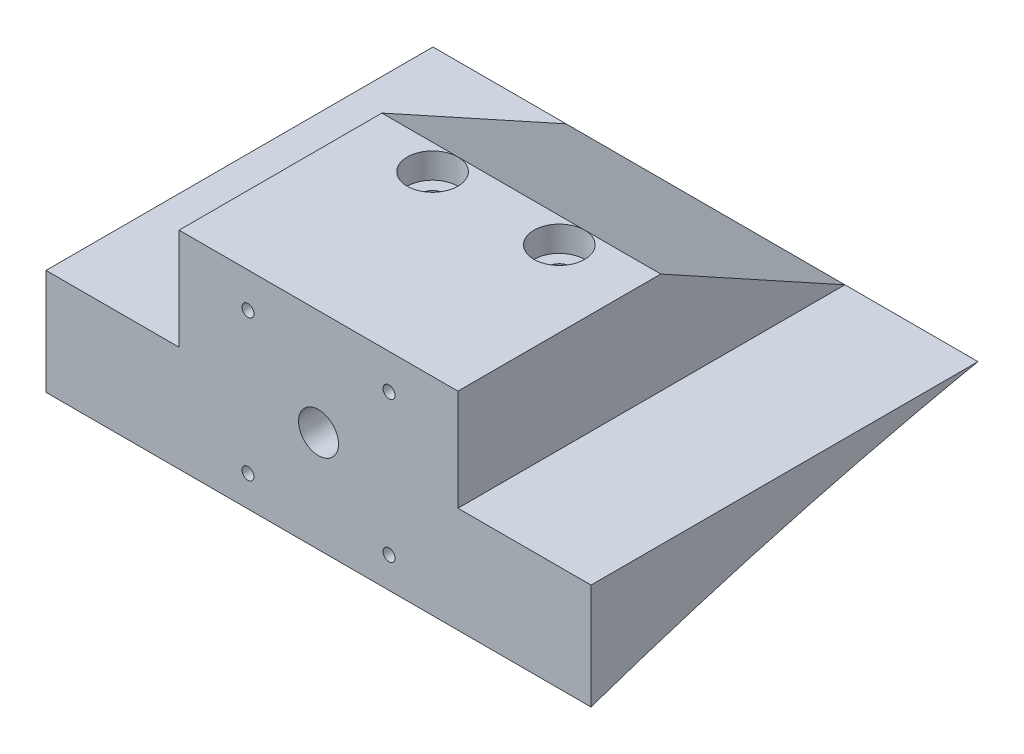
ISO-10303-21;
HEADER;
FILE_DESCRIPTION(('STEP AP214'),'2;1');
FILE_NAME('part.step','',(''),(''),'','','');
FILE_SCHEMA(('AUTOMOTIVE_DESIGN { 1 0 10303 214 1 1 1 1 }'));
ENDSEC;
DATA;
#1=APPLICATION_CONTEXT('core data for automotive mechanical design processes');
#2=APPLICATION_PROTOCOL_DEFINITION('international standard','automotive_design',2000,#1);
#3=PRODUCT_CONTEXT('',#1,'mechanical');
#4=PRODUCT('Part','Part','',(#3));
#5=PRODUCT_RELATED_PRODUCT_CATEGORY('part','',(#4));
#6=PRODUCT_DEFINITION_FORMATION('','',#4);
#7=PRODUCT_DEFINITION_CONTEXT('part definition',#1,'design');
#8=PRODUCT_DEFINITION('design','',#6,#7);
#9=PRODUCT_DEFINITION_SHAPE('','',#8);
#10=(LENGTH_UNIT() NAMED_UNIT(*) SI_UNIT(.MILLI.,.METRE.));
#11=(NAMED_UNIT(*) PLANE_ANGLE_UNIT() SI_UNIT($,.RADIAN.));
#12=(NAMED_UNIT(*) SI_UNIT($,.STERADIAN.) SOLID_ANGLE_UNIT());
#13=UNCERTAINTY_MEASURE_WITH_UNIT(LENGTH_MEASURE(1.E-05),#10,'distance_accuracy_value','');
#14=(GEOMETRIC_REPRESENTATION_CONTEXT(3) GLOBAL_UNCERTAINTY_ASSIGNED_CONTEXT((#13)) GLOBAL_UNIT_ASSIGNED_CONTEXT((#10,
#11,#12)) REPRESENTATION_CONTEXT('',''));
#15=CARTESIAN_POINT('',(0.,0.,0.));
#16=DIRECTION('',(0.,0.,1.));
#17=DIRECTION('',(1.,0.,0.));
#18=AXIS2_PLACEMENT_3D('',#15,#16,#17);
#19=CARTESIAN_POINT('',(15.875,0.,311.23718792331));
#20=DIRECTION('',(0.,1.,0.));
#21=DIRECTION('',(0.,0.,1.));
#22=AXIS2_PLACEMENT_3D('',#19,#20,#21);
#23=CYLINDRICAL_SURFACE('',#22,3.175);
#24=CARTESIAN_POINT('',(15.875,12.8934576991809,314.41218792331));
#25=CARTESIAN_POINT('',(16.0484001733217,12.8934601596742,314.412179400683));
#26=CARTESIAN_POINT('',(16.2219313781732,12.8974847284631,314.397925651184));
#27=CARTESIAN_POINT('',(16.564124311233,12.9134512899204,314.34135951219));
#28=CARTESIAN_POINT('',(16.7327797399898,12.9254030857684,314.299012381092));
#29=CARTESIAN_POINT('',(17.0601145627883,12.9567818719714,314.187774208788));
#30=CARTESIAN_POINT('',(17.2188064607542,12.9761992659038,314.118917243677));
#31=CARTESIAN_POINT('',(17.5221429330582,13.0218408329673,313.956951414703));
#32=CARTESIAN_POINT('',(17.6667900604149,13.0480637658117,313.86384696985));
#33=CARTESIAN_POINT('',(17.9406887057881,13.1069553193313,313.654571440212));
#34=CARTESIAN_POINT('',(18.0696485515073,13.1397226740119,313.538046825705));
#35=CARTESIAN_POINT('',(18.3062734431336,13.2104074076418,313.286426227292));
#36=CARTESIAN_POINT('',(18.4139344946877,13.2483257503572,313.151326767916));
#37=CARTESIAN_POINT('',(18.6089694904266,13.3296429245063,312.861271855313));
#38=CARTESIAN_POINT('',(18.6954864133981,13.3731886413238,312.705781351445));
#39=CARTESIAN_POINT('',(18.8411963650823,13.4633800748649,312.383322478462));
#40=CARTESIAN_POINT('',(18.9003844224529,13.5100263538419,312.216352027395));
#41=CARTESIAN_POINT('',(18.9916935573852,13.6067494547242,311.869672815196));
#42=CARTESIAN_POINT('',(19.0228411334461,13.6568888543097,311.689724686595));
#43=CARTESIAN_POINT('',(19.0539299833107,13.7577318850193,311.327299516205));
#44=CARTESIAN_POINT('',(19.0538673926597,13.8084355852381,311.144822164044));
#45=CARTESIAN_POINT('',(19.0222361502414,13.9098974755162,310.779168596644));
#46=CARTESIAN_POINT('',(18.990119751576,13.9606412864986,310.596035389207));
#47=CARTESIAN_POINT('',(18.8942423624534,14.0598317627744,310.237577996254));
#48=CARTESIAN_POINT('',(18.8304811066785,14.1082784088042,310.062253876227));
#49=CARTESIAN_POINT('',(18.6732888364767,14.2011493691007,309.725742823407));
#50=CARTESIAN_POINT('',(18.5800524051621,14.245597674341,309.564471781438));
#51=CARTESIAN_POINT('',(18.3660637092331,14.3294619043377,309.25985237654));
#52=CARTESIAN_POINT('',(18.2453152440537,14.3688785228028,309.116501543044));
#53=CARTESIAN_POINT('',(17.9831889792607,14.4403998444346,308.856149481219));
#54=CARTESIAN_POINT('',(17.842471993035,14.4726762292756,308.738530565934));
#55=CARTESIAN_POINT('',(17.5419105642375,14.53020007386,308.528757473046));
#56=CARTESIAN_POINT('',(17.3820703328134,14.5554490770511,308.4365977038));
#57=CARTESIAN_POINT('',(17.0540018318081,14.5972736929156,308.283861244001));
#58=CARTESIAN_POINT('',(16.8862828041167,14.6141288661373,308.222266851755));
#59=CARTESIAN_POINT('',(16.5423281583609,14.6399194679222,308.127995569833));
#60=CARTESIAN_POINT('',(16.3660941305453,14.6488563693075,308.095313302418));
#61=CARTESIAN_POINT('',(16.0154068867891,14.658364928889,308.060539703773));
#62=CARTESIAN_POINT('',(15.8410415943943,14.6591634362974,308.057618806182));
#63=CARTESIAN_POINT('',(15.4943278204244,14.6529594240392,308.080308391656));
#64=CARTESIAN_POINT('',(15.3219791898878,14.6459574842783,308.105916753782));
#65=CARTESIAN_POINT('',(14.9855790069189,14.6244734201841,308.184458490389));
#66=CARTESIAN_POINT('',(14.8214724483995,14.6100511200662,308.237173325912));
#67=CARTESIAN_POINT('',(14.5045729686102,14.57422260196,308.368050607518));
#68=CARTESIAN_POINT('',(14.3517805761845,14.5528160577683,308.446214242203));
#69=CARTESIAN_POINT('',(14.0593443849128,14.5033133451178,308.626826608787));
#70=CARTESIAN_POINT('',(13.9199261129739,14.4751237310767,308.729614475608));
#71=CARTESIAN_POINT('',(13.6602913096862,14.4130693775584,308.955668214572));
#72=CARTESIAN_POINT('',(13.5400774016791,14.3792038640383,309.078936879735));
#73=CARTESIAN_POINT('',(13.3182693780218,14.3056288280878,309.346456831374));
#74=CARTESIAN_POINT('',(13.2173633651574,14.2657713535833,309.491237739943));
#75=CARTESIAN_POINT('',(13.0412063830412,14.1821517566486,309.794612774373));
#76=CARTESIAN_POINT('',(12.9659598708815,14.1383889575217,309.953209294025));
#77=CARTESIAN_POINT('',(12.8405745717418,14.046551007229,310.285600976071));
#78=CARTESIAN_POINT('',(12.7913982448472,13.998378885813,310.459732652294));
#79=CARTESIAN_POINT('',(12.7232628156054,13.9004123096499,310.813373735486));
#80=CARTESIAN_POINT('',(12.704308419096,13.8506176034826,310.992883975515));
#81=CARTESIAN_POINT('',(12.6969129863081,13.7495104316078,311.356874507744));
#82=CARTESIAN_POINT('',(12.7092320560017,13.698190703896,311.541368674873));
#83=CARTESIAN_POINT('',(12.7657171685962,13.5966921907596,311.905754706587));
#84=CARTESIAN_POINT('',(12.8098852308822,13.546513477889,312.085646278595));
#85=CARTESIAN_POINT('',(12.9292777622742,13.4485897920202,312.436249732777));
#86=CARTESIAN_POINT('',(13.0046043952467,13.4008534110753,312.606929309469));
#87=CARTESIAN_POINT('',(13.1845459658196,13.3094647727358,312.933298995434));
#88=CARTESIAN_POINT('',(13.2891573460662,13.2658120201428,313.088990922242));
#89=CARTESIAN_POINT('',(13.5225559335782,13.1848768657952,313.377356786618));
#90=CARTESIAN_POINT('',(13.6507943004713,13.147480731107,313.510442559525));
#91=CARTESIAN_POINT('',(13.9294689239249,13.0792485352745,313.753066321355));
#92=CARTESIAN_POINT('',(14.0799063624099,13.0484128236343,313.862603055715));
#93=CARTESIAN_POINT('',(14.3929343060126,12.9954068772844,314.050777161542));
#94=CARTESIAN_POINT('',(14.5549032976246,12.9729677396676,314.130373913652));
#95=CARTESIAN_POINT('',(14.8906338114282,12.9361028184038,314.261091676272));
#96=CARTESIAN_POINT('',(15.0643768465432,12.9216647846047,314.312256218472));
#97=CARTESIAN_POINT('',(15.3454049678414,12.9055038133408,314.369516754343));
#98=CARTESIAN_POINT('',(15.4506196537388,12.9009934651837,314.385494553754));
#99=CARTESIAN_POINT('',(15.6622064554082,12.894969680461,314.406832656473));
#100=CARTESIAN_POINT('',(15.7685785499799,12.8934561890944,314.41219315393));
#101=CARTESIAN_POINT('',(15.875,12.8934576991809,314.41218792331));
#102=B_SPLINE_CURVE_WITH_KNOTS('',3,(#24,#25,#26,#27,#28,#29,#30,#31,#32,#33,#34,#35,#36,#37,
#38,#39,#40,#41,#42,#43,#44,#45,#46,#47,#48,#49,#50,#51,#52,#53,#54,#55,#56,#57,#58,#59,#60,#61,
#62,#63,#64,#65,#66,#67,#68,#69,#70,#71,#72,#73,#74,#75,#76,#77,#78,#79,#80,#81,#82,#83,#84,#85,
#86,#87,#88,#89,#90,#91,#92,#93,#94,#95,#96,#97,#98,#99,#100,#101),.UNSPECIFIED.,.T.,.F.,(4,2,2,
2,2,2,2,2,2,2,2,2,2,2,2,2,2,2,2,2,2,2,2,2,2,2,2,2,2,2,2,2,2,2,2,2,2,2,4),(0.,0.519803674629431,
1.04025136429398,1.56003228516709,2.07971854414763,2.60793488240574,3.13625018807757,
3.68334241813718,4.2305341295336,4.7960626503819,5.36166119520434,5.93709326215981,
6.51253015374714,7.08424489949952,7.65588073876932,8.21175068875435,8.76749845462786,
9.30323596110054,9.83887379787253,10.3595390456821,10.8801655884542,11.3966590338946,
11.9131766059416,12.4372643054683,12.9614235349692,13.5017384174017,14.0421471055561,
14.6013189939849,15.1605779422179,15.7335592117896,16.3065768144283,16.8814883313384,
17.4563300413655,18.0192004542755,18.5821008463918,19.1250061757957,19.6670779729347,
19.9861045996334,20.3051253925204),.UNSPECIFIED.);
#103=CARTESIAN_POINT('',(15.875,12.8934576991809,314.41218792331));
#104=VERTEX_POINT('',#103);
#105=EDGE_CURVE('E218',#104,#104,#102,.T.);
#106=ORIENTED_EDGE('',*,*,#105,.F.);
#107=EDGE_LOOP('',(#106));
#108=FACE_BOUND('',#107,.T.);
#109=CARTESIAN_POINT('',(15.875,45.5125779755512,311.23718792331));
#110=DIRECTION('',(0.,1.,0.));
#111=DIRECTION('',(0.,0.,1.));
#112=AXIS2_PLACEMENT_3D('',#109,#110,#111);
#113=CIRCLE('',#112,3.175);
#114=CARTESIAN_POINT('',(15.875,45.5125779755512,314.41218792331));
#115=VERTEX_POINT('',#114);
#116=EDGE_CURVE('E44',#115,#115,#113,.F.);
#117=ORIENTED_EDGE('',*,*,#116,.F.);
#118=EDGE_LOOP('',(#117));
#119=FACE_BOUND('',#118,.T.);
#120=ADVANCED_FACE('F38',(#108,#119),#23,.F.);
#121=CARTESIAN_POINT('',(-15.875,0.,311.23718792331));
#122=DIRECTION('',(0.,1.,0.));
#123=DIRECTION('',(0.,0.,1.));
#124=AXIS2_PLACEMENT_3D('',#121,#122,#123);
#125=CYLINDRICAL_SURFACE('',#124,3.175);
#126=CARTESIAN_POINT('',(-15.875,12.8934576991809,314.41218792331));
#127=CARTESIAN_POINT('',(-15.7015998266783,12.8934601596742,314.412179400683));
#128=CARTESIAN_POINT('',(-15.5280686218269,12.8974847284631,314.397925651184));
#129=CARTESIAN_POINT('',(-15.185875688767,12.9134512899204,314.34135951219));
#130=CARTESIAN_POINT('',(-15.0172202600102,12.9254030857684,314.299012381092));
#131=CARTESIAN_POINT('',(-14.6898854372118,12.9567818719714,314.187774208788));
#132=CARTESIAN_POINT('',(-14.5311935392458,12.9761992659038,314.118917243677));
#133=CARTESIAN_POINT('',(-14.2278570669419,13.0218408329672,313.956951414703));
#134=CARTESIAN_POINT('',(-14.0832099395852,13.0480637658117,313.86384696985));
#135=CARTESIAN_POINT('',(-13.8093112942119,13.1069553193312,313.654571440212));
#136=CARTESIAN_POINT('',(-13.6803514484928,13.1397226740119,313.538046825705));
#137=CARTESIAN_POINT('',(-13.4437265568665,13.2104074076418,313.286426227292));
#138=CARTESIAN_POINT('',(-13.3360655053123,13.2483257503572,313.151326767916));
#139=CARTESIAN_POINT('',(-13.1410305095734,13.3296429245063,312.861271855313));
#140=CARTESIAN_POINT('',(-13.0545135866019,13.3731886413238,312.705781351445));
#141=CARTESIAN_POINT('',(-12.9088036349178,13.4633800748649,312.383322478462));
#142=CARTESIAN_POINT('',(-12.8496155775471,13.5100263538419,312.216352027395));
#143=CARTESIAN_POINT('',(-12.7583064426148,13.6067494547242,311.869672815196));
#144=CARTESIAN_POINT('',(-12.7271588665539,13.6568888543097,311.689724686595));
#145=CARTESIAN_POINT('',(-12.6960700166893,13.7577318850192,311.327299516205));
#146=CARTESIAN_POINT('',(-12.6961326073403,13.8084355852381,311.144822164044));
#147=CARTESIAN_POINT('',(-12.7277638497586,13.9098974755162,310.779168596644));
#148=CARTESIAN_POINT('',(-12.759880248424,13.9606412864986,310.596035389207));
#149=CARTESIAN_POINT('',(-12.8557576375466,14.0598317627744,310.237577996254));
#150=CARTESIAN_POINT('',(-12.9195188933215,14.1082784088042,310.062253876227));
#151=CARTESIAN_POINT('',(-13.0767111635232,14.2011493691007,309.725742823407));
#152=CARTESIAN_POINT('',(-13.1699475948378,14.2455976743409,309.564471781438));
#153=CARTESIAN_POINT('',(-13.3839362907669,14.3294619043377,309.25985237654));
#154=CARTESIAN_POINT('',(-13.5046847559463,14.3688785228028,309.116501543044));
#155=CARTESIAN_POINT('',(-13.7668110207392,14.4403998444346,308.856149481219));
#156=CARTESIAN_POINT('',(-13.9075280069649,14.4726762292755,308.738530565934));
#157=CARTESIAN_POINT('',(-14.2080894357625,14.53020007386,308.528757473046));
#158=CARTESIAN_POINT('',(-14.3679296671865,14.5554490770511,308.4365977038));
#159=CARTESIAN_POINT('',(-14.6959981681918,14.5972736929156,308.283861244001));
#160=CARTESIAN_POINT('',(-14.8637171958832,14.6141288661373,308.222266851755));
#161=CARTESIAN_POINT('',(-15.2076718416391,14.6399194679222,308.127995569833));
#162=CARTESIAN_POINT('',(-15.3839058694546,14.6488563693075,308.095313302418));
#163=CARTESIAN_POINT('',(-15.7345931132108,14.658364928889,308.060539703773));
#164=CARTESIAN_POINT('',(-15.9089584056056,14.6591634362974,308.057618806182));
#165=CARTESIAN_POINT('',(-16.2556721795756,14.6529594240392,308.080308391656));
#166=CARTESIAN_POINT('',(-16.4280208101122,14.6459574842783,308.105916753782));
#167=CARTESIAN_POINT('',(-16.7644209930811,14.6244734201841,308.184458490389));
#168=CARTESIAN_POINT('',(-16.9285275516004,14.6100511200662,308.237173325912));
#169=CARTESIAN_POINT('',(-17.2454270313898,14.57422260196,308.368050607518));
#170=CARTESIAN_POINT('',(-17.3982194238155,14.5528160577683,308.446214242203));
#171=CARTESIAN_POINT('',(-17.6906556150872,14.5033133451178,308.626826608787));
#172=CARTESIAN_POINT('',(-17.8300738870261,14.4751237310767,308.729614475608));
#173=CARTESIAN_POINT('',(-18.0897086903137,14.4130693775584,308.955668214572));
#174=CARTESIAN_POINT('',(-18.2099225983208,14.3792038640383,309.078936879735));
#175=CARTESIAN_POINT('',(-18.4317306219782,14.3056288280878,309.346456831374));
#176=CARTESIAN_POINT('',(-18.5326366348426,14.2657713535833,309.491237739943));
#177=CARTESIAN_POINT('',(-18.7087936169588,14.1821517566486,309.794612774373));
#178=CARTESIAN_POINT('',(-18.7840401291185,14.1383889575217,309.953209294025));
#179=CARTESIAN_POINT('',(-18.9094254282581,14.046551007229,310.285600976071));
#180=CARTESIAN_POINT('',(-18.9586017551528,13.9983788858131,310.459732652294));
#181=CARTESIAN_POINT('',(-19.0267371843947,13.9004123096499,310.813373735486));
#182=CARTESIAN_POINT('',(-19.045691580904,13.8506176034826,310.992883975515));
#183=CARTESIAN_POINT('',(-19.0530870136919,13.7495104316078,311.356874507744));
#184=CARTESIAN_POINT('',(-19.0407679439983,13.6981907038961,311.541368674873));
#185=CARTESIAN_POINT('',(-18.9842828314039,13.5966921907596,311.905754706587));
#186=CARTESIAN_POINT('',(-18.9401147691178,13.546513477889,312.085646278595));
#187=CARTESIAN_POINT('',(-18.8207222377258,13.4485897920202,312.436249732777));
#188=CARTESIAN_POINT('',(-18.7453956047533,13.4008534110753,312.606929309469));
#189=CARTESIAN_POINT('',(-18.5654540341804,13.3094647727358,312.933298995434));
#190=CARTESIAN_POINT('',(-18.4608426539338,13.2658120201428,313.088990922242));
#191=CARTESIAN_POINT('',(-18.2274440664219,13.1848768657952,313.377356786618));
#192=CARTESIAN_POINT('',(-18.0992056995287,13.147480731107,313.510442559525));
#193=CARTESIAN_POINT('',(-17.8205310760752,13.0792485352745,313.753066321355));
#194=CARTESIAN_POINT('',(-17.6700936375902,13.0484128236343,313.862603055715));
#195=CARTESIAN_POINT('',(-17.3570656939874,12.9954068772845,314.050777161542));
#196=CARTESIAN_POINT('',(-17.1950967023754,12.9729677396676,314.130373913652));
#197=CARTESIAN_POINT('',(-16.8593661885718,12.9361028184038,314.261091676272));
#198=CARTESIAN_POINT('',(-16.6856231534569,12.9216647846047,314.312256218472));
#199=CARTESIAN_POINT('',(-16.4045950321586,12.9055038133408,314.369516754343));
#200=CARTESIAN_POINT('',(-16.2993803462613,12.9009934651837,314.385494553754));
#201=CARTESIAN_POINT('',(-16.0877935445919,12.894969680461,314.406832656473));
#202=CARTESIAN_POINT('',(-15.9814214500201,12.8934561890944,314.41219315393));
#203=CARTESIAN_POINT('',(-15.875,12.8934576991809,314.41218792331));
#204=B_SPLINE_CURVE_WITH_KNOTS('',3,(#126,#127,#128,#129,#130,#131,#132,#133,#134,#135,#136,
#137,#138,#139,#140,#141,#142,#143,#144,#145,#146,#147,#148,#149,#150,#151,#152,#153,#154,#155,
#156,#157,#158,#159,#160,#161,#162,#163,#164,#165,#166,#167,#168,#169,#170,#171,#172,#173,#174,
#175,#176,#177,#178,#179,#180,#181,#182,#183,#184,#185,#186,#187,#188,#189,#190,#191,#192,#193,
#194,#195,#196,#197,#198,#199,#200,#201,#202,#203),.UNSPECIFIED.,.T.,.F.,(4,2,2,2,2,2,2,2,2,2,2,
2,2,2,2,2,2,2,2,2,2,2,2,2,2,2,2,2,2,2,2,2,2,2,2,2,2,2,4),(0.,0.519803674629407,1.04025136429395,
1.56003228516705,2.07971854414752,2.60793488240564,3.13625018807759,3.6833424181371,
4.23053412953348,4.79606265038177,5.36166119520433,5.9370932621598,6.51253015374712,
7.08424489949945,7.65588073876919,8.21175068875426,8.76749845462783,9.3032359611005,
9.83887379787248,10.3595390456821,10.8801655884542,11.3966590338945,11.9131766059416,
12.4372643054683,12.9614235349692,13.5017384174016,14.0421471055561,14.6013189939848,
15.1605779422177,15.7335592117895,16.3065768144283,16.8814883313384,17.4563300413654,
18.0192004542754,18.5821008463917,19.1250061757956,19.6670779729346,19.9861045996334,
20.3051253925204),.UNSPECIFIED.);
#205=CARTESIAN_POINT('',(-15.875,12.8934576991809,314.41218792331));
#206=VERTEX_POINT('',#205);
#207=EDGE_CURVE('E227',#206,#206,#204,.T.);
#208=ORIENTED_EDGE('',*,*,#207,.F.);
#209=EDGE_LOOP('',(#208));
#210=FACE_BOUND('',#209,.T.);
#211=CARTESIAN_POINT('',(-15.875,45.5125779755512,311.23718792331));
#212=DIRECTION('',(0.,1.,0.));
#213=DIRECTION('',(0.,0.,1.));
#214=AXIS2_PLACEMENT_3D('',#211,#212,#213);
#215=CIRCLE('',#214,3.175);
#216=CARTESIAN_POINT('',(-15.875,45.5125779755512,314.41218792331));
#217=VERTEX_POINT('',#216);
#218=EDGE_CURVE('E174',#217,#217,#215,.F.);
#219=ORIENTED_EDGE('',*,*,#218,.F.);
#220=EDGE_LOOP('',(#219));
#221=FACE_BOUND('',#220,.T.);
#222=ADVANCED_FACE('F236',(#210,#221),#125,.F.);
#223=CARTESIAN_POINT('',(68.2625,26.4625779755512,258.749759613422));
#224=DIRECTION('',(0.,-1.,0.));
#225=DIRECTION('',(0.,0.,-1.));
#226=AXIS2_PLACEMENT_3D('',#223,#224,#225);
#227=PLANE('',#226);
#228=DIRECTION('',(0.,0.,1.));
#229=VECTOR('',#228,1.);
#230=CARTESIAN_POINT('',(-34.925,26.4625779755512,304.88718792331));
#231=LINE('',#230,#229);
#232=CARTESIAN_POINT('',(-34.925,26.4625779755513,258.749759613422));
#233=VERTEX_POINT('',#232);
#234=CARTESIAN_POINT('',(-34.925,26.4625779755512,355.68718792331));
#235=VERTEX_POINT('',#234);
#236=EDGE_CURVE('E115',#233,#235,#231,.T.);
#237=ORIENTED_EDGE('',*,*,#236,.F.);
#238=DIRECTION('',(-1.,0.,0.));
#239=VECTOR('',#238,1.);
#240=CARTESIAN_POINT('',(68.2625,26.4625779755512,258.749759613422));
#241=LINE('',#240,#239);
#242=CARTESIAN_POINT('',(-68.2625,26.4625779755512,258.749759613422));
#243=VERTEX_POINT('',#242);
#244=EDGE_CURVE('E49',#233,#243,#241,.T.);
#245=ORIENTED_EDGE('',*,*,#244,.T.);
#246=DIRECTION('',(0.,0.,1.));
#247=VECTOR('',#246,1.);
#248=CARTESIAN_POINT('',(-68.2625,26.4625779755512,258.749759613422));
#249=LINE('',#248,#247);
#250=CARTESIAN_POINT('',(-68.2625,26.4625779755512,355.68718792331));
#251=VERTEX_POINT('',#250);
#252=EDGE_CURVE('E150',#243,#251,#249,.T.);
#253=ORIENTED_EDGE('',*,*,#252,.T.);
#254=DIRECTION('',(-1.,0.,0.));
#255=VECTOR('',#254,1.);
#256=CARTESIAN_POINT('',(68.2625,26.4625779755512,355.68718792331));
#257=LINE('',#256,#255);
#258=EDGE_CURVE('E173',#235,#251,#257,.T.);
#259=ORIENTED_EDGE('',*,*,#258,.F.);
#260=EDGE_LOOP('',(#237,#245,#253,#259));
#261=FACE_BOUND('',#260,.T.);
#262=ADVANCED_FACE('F261',(#261),#227,.F.);
#263=CARTESIAN_POINT('',(68.2625,26.4625779755512,258.749759613422));
#264=VERTEX_POINT('',#263);
#265=CARTESIAN_POINT('',(34.925,26.4625779755513,258.749759613422));
#266=VERTEX_POINT('',#265);
#267=EDGE_CURVE('E11',#264,#266,#241,.T.);
#268=ORIENTED_EDGE('',*,*,#267,.T.);
#269=DIRECTION('',(0.,0.,1.));
#270=VECTOR('',#269,1.);
#271=CARTESIAN_POINT('',(34.925,26.4625779755512,304.88718792331));
#272=LINE('',#271,#270);
#273=CARTESIAN_POINT('',(34.925,26.4625779755512,355.68718792331));
#274=VERTEX_POINT('',#273);
#275=EDGE_CURVE('E104',#266,#274,#272,.T.);
#276=ORIENTED_EDGE('',*,*,#275,.T.);
#277=CARTESIAN_POINT('',(68.2625,26.4625779755512,355.68718792331));
#278=VERTEX_POINT('',#277);
#279=EDGE_CURVE('E140',#278,#274,#257,.T.);
#280=ORIENTED_EDGE('',*,*,#279,.F.);
#281=DIRECTION('',(0.,0.,1.));
#282=VECTOR('',#281,1.);
#283=CARTESIAN_POINT('',(68.2625,26.4625779755512,258.749759613422));
#284=LINE('',#283,#282);
#285=EDGE_CURVE('E138',#264,#278,#284,.T.);
#286=ORIENTED_EDGE('',*,*,#285,.F.);
#287=EDGE_LOOP('',(#268,#276,#280,#286));
#288=FACE_BOUND('',#287,.T.);
#289=ADVANCED_FACE('F137',(#288),#227,.F.);
#290=CARTESIAN_POINT('',(68.2625,0.,355.68718792331));
#291=CARTESIAN_POINT('',(68.2625,0.107976187738259,355.370551539557));
#292=CARTESIAN_POINT('',(68.2625,0.538185956224347,354.10897648115));
#293=CARTESIAN_POINT('',(68.2625,1.50285946278197,351.284999826928));
#294=CARTESIAN_POINT('',(68.2625,3.05886265174221,346.602313415816));
#295=CARTESIAN_POINT('',(68.2625,6.25189343990231,336.81536123673));
#296=CARTESIAN_POINT('',(68.2625,11.2777972503292,320.429894611746));
#297=CARTESIAN_POINT('',(68.2625,16.5496301870897,301.357119068703));
#298=CARTESIAN_POINT('',(68.2625,21.086195796725,283.167308194169));
#299=CARTESIAN_POINT('',(68.2625,24.0715520010414,270.107851123818));
#300=CARTESIAN_POINT('',(68.2625,25.8282853883134,261.828911243072));
#301=CARTESIAN_POINT('',(68.2625,26.4625779755512,258.749759613422));
#302=B_SPLINE_CURVE_WITH_KNOTS('',3,(#290,#291,#292,#293,#294,#295,#296,#297,#298,#299,#300,
#301),.UNSPECIFIED.,.F.,.F.,(4,1,1,1,1,1,1,1,1,4),(0.,0.00137157662502608,0.00546477584250823,
0.0122348018502246,0.0216019692657692,0.0476712497544171,0.0824962611380079,0.102719148689264,
0.124527079157664,0.137415964889423),.UNSPECIFIED.);
#303=DIRECTION('',(-1.,0.,0.));
#304=VECTOR('',#303,1.);
#305=SURFACE_OF_LINEAR_EXTRUSION('',#302,#304);
#306=ORIENTED_EDGE('',*,*,#207,.T.);
#307=EDGE_LOOP('',(#306));
#308=FACE_BOUND('',#307,.T.);
#309=ORIENTED_EDGE('',*,*,#105,.T.);
#310=EDGE_LOOP('',(#309));
#311=FACE_BOUND('',#310,.T.);
#312=CARTESIAN_POINT('',(-68.2625,0.,355.68718792331));
#313=CARTESIAN_POINT('',(-68.2625,0.107976187738259,355.370551539557));
#314=CARTESIAN_POINT('',(-68.2625,0.538185956224347,354.10897648115));
#315=CARTESIAN_POINT('',(-68.2625,1.50285946278197,351.284999826928));
#316=CARTESIAN_POINT('',(-68.2625,3.05886265174221,346.602313415816));
#317=CARTESIAN_POINT('',(-68.2625,6.25189343990231,336.81536123673));
#318=CARTESIAN_POINT('',(-68.2625,11.2777972503292,320.429894611746));
#319=CARTESIAN_POINT('',(-68.2625,16.5496301870897,301.357119068703));
#320=CARTESIAN_POINT('',(-68.2625,21.086195796725,283.167308194169));
#321=CARTESIAN_POINT('',(-68.2625,24.0715520010414,270.107851123818));
#322=CARTESIAN_POINT('',(-68.2625,25.8282853883134,261.828911243072));
#323=CARTESIAN_POINT('',(-68.2625,26.4625779755512,258.749759613422));
#324=B_SPLINE_CURVE_WITH_KNOTS('',3,(#312,#313,#314,#315,#316,#317,#318,#319,#320,#321,#322,
#323),.UNSPECIFIED.,.F.,.F.,(4,1,1,1,1,1,1,1,1,4),(0.,0.00137157662502608,0.00546477584250823,
0.0122348018502246,0.0216019692657692,0.0476712497544171,0.0824962611380079,0.102719148689264,
0.124527079157664,0.137415964889423),.UNSPECIFIED.);
#325=CARTESIAN_POINT('',(-68.2625,0.,355.68718792331));
#326=VERTEX_POINT('',#325);
#327=EDGE_CURVE('E162',#326,#243,#324,.T.);
#328=ORIENTED_EDGE('',*,*,#327,.T.);
#329=ORIENTED_EDGE('',*,*,#244,.F.);
#330=DIRECTION('',(-1.,0.,0.));
#331=VECTOR('',#330,1.);
#332=CARTESIAN_POINT('',(87.5920892593283,26.4625779755513,258.749759613422));
#333=LINE('',#332,#331);
#334=EDGE_CURVE('E122',#266,#233,#333,.T.);
#335=ORIENTED_EDGE('',*,*,#334,.F.);
#336=ORIENTED_EDGE('',*,*,#267,.F.);
#337=CARTESIAN_POINT('',(68.2625,0.,355.68718792331));
#338=VERTEX_POINT('',#337);
#339=EDGE_CURVE('E144',#338,#264,#302,.T.);
#340=ORIENTED_EDGE('',*,*,#339,.F.);
#341=DIRECTION('',(-1.,0.,0.));
#342=VECTOR('',#341,1.);
#343=CARTESIAN_POINT('',(68.2625,0.,355.68718792331));
#344=LINE('',#343,#342);
#345=EDGE_CURVE('E161',#338,#326,#344,.T.);
#346=ORIENTED_EDGE('',*,*,#345,.T.);
#347=EDGE_LOOP('',(#328,#329,#335,#336,#340,#346));
#348=FACE_BOUND('',#347,.T.);
#349=ADVANCED_FACE('F40',(#308,#311,#348),#305,.F.);
#350=CARTESIAN_POINT('',(68.2625,26.4625779755512,355.68718792331));
#351=DIRECTION('',(0.,0.,-1.));
#352=DIRECTION('',(-1.,0.,0.));
#353=AXIS2_PLACEMENT_3D('',#350,#351,#352);
#354=PLANE('',#353);
#355=CARTESIAN_POINT('',(-17.6776695296638,43.0776695296636,355.68718792331));
#356=DIRECTION('',(0.,0.,1.));
#357=DIRECTION('',(0.,1.,0.));
#358=AXIS2_PLACEMENT_3D('',#355,#356,#357);
#359=CIRCLE('',#358,1.5);
#360=CARTESIAN_POINT('',(-17.6776695296638,44.5776695296636,355.68718792331));
#361=VERTEX_POINT('',#360);
#362=EDGE_CURVE('E191',#361,#361,#359,.T.);
#363=ORIENTED_EDGE('',*,*,#362,.F.);
#364=EDGE_LOOP('',(#363));
#365=FACE_BOUND('',#364,.T.);
#366=CARTESIAN_POINT('',(-17.6776695296637,7.72233047033629,355.68718792331));
#367=DIRECTION('',(0.,0.,1.));
#368=DIRECTION('',(-1.,0.,0.));
#369=AXIS2_PLACEMENT_3D('',#366,#367,#368);
#370=CIRCLE('',#369,1.5);
#371=CARTESIAN_POINT('',(-19.1776695296637,7.72233047033629,355.68718792331));
#372=VERTEX_POINT('',#371);
#373=EDGE_CURVE('E199',#372,#372,#370,.T.);
#374=ORIENTED_EDGE('',*,*,#373,.F.);
#375=EDGE_LOOP('',(#374));
#376=FACE_BOUND('',#375,.T.);
#377=CARTESIAN_POINT('',(17.6776695296639,7.72233047033654,355.68718792331));
#378=DIRECTION('',(0.,0.,1.));
#379=DIRECTION('',(0.,-1.,0.));
#380=AXIS2_PLACEMENT_3D('',#377,#378,#379);
#381=CIRCLE('',#380,1.5);
#382=CARTESIAN_POINT('',(17.6776695296639,6.22233047033654,355.68718792331));
#383=VERTEX_POINT('',#382);
#384=EDGE_CURVE('E135',#383,#383,#381,.T.);
#385=ORIENTED_EDGE('',*,*,#384,.F.);
#386=EDGE_LOOP('',(#385));
#387=FACE_BOUND('',#386,.T.);
#388=CARTESIAN_POINT('',(17.6776695296637,43.0776695296637,355.68718792331));
#389=DIRECTION('',(0.,0.,1.));
#390=DIRECTION('',(1.,0.,0.));
#391=AXIS2_PLACEMENT_3D('',#388,#389,#390);
#392=CIRCLE('',#391,1.5);
#393=CARTESIAN_POINT('',(19.1776695296637,43.0776695296637,355.68718792331));
#394=VERTEX_POINT('',#393);
#395=EDGE_CURVE('E198',#394,#394,#392,.T.);
#396=ORIENTED_EDGE('',*,*,#395,.F.);
#397=EDGE_LOOP('',(#396));
#398=FACE_BOUND('',#397,.T.);
#399=CARTESIAN_POINT('',(0.,25.4,355.68718792331));
#400=DIRECTION('',(0.,0.,1.));
#401=DIRECTION('',(1.,0.,0.));
#402=AXIS2_PLACEMENT_3D('',#399,#400,#401);
#403=CIRCLE('',#402,5.);
#404=CARTESIAN_POINT('',(5.,25.4,355.68718792331));
#405=VERTEX_POINT('',#404);
#406=EDGE_CURVE('E212',#405,#405,#403,.T.);
#407=ORIENTED_EDGE('',*,*,#406,.F.);
#408=EDGE_LOOP('',(#407));
#409=FACE_BOUND('',#408,.T.);
#410=DIRECTION('',(0.,-1.,0.));
#411=VECTOR('',#410,1.);
#412=CARTESIAN_POINT('',(-68.2625,26.4625779755512,355.68718792331));
#413=LINE('',#412,#411);
#414=EDGE_CURVE('E149',#251,#326,#413,.T.);
#415=ORIENTED_EDGE('',*,*,#414,.T.);
#416=ORIENTED_EDGE('',*,*,#345,.F.);
#417=DIRECTION('',(0.,-1.,0.));
#418=VECTOR('',#417,1.);
#419=CARTESIAN_POINT('',(68.2625,26.4625779755512,355.68718792331));
#420=LINE('',#419,#418);
#421=EDGE_CURVE('E143',#278,#338,#420,.T.);
#422=ORIENTED_EDGE('',*,*,#421,.F.);
#423=ORIENTED_EDGE('',*,*,#279,.T.);
#424=DIRECTION('',(0.,1.,0.));
#425=VECTOR('',#424,1.);
#426=CARTESIAN_POINT('',(34.925,51.8625779755512,355.68718792331));
#427=LINE('',#426,#425);
#428=CARTESIAN_POINT('',(34.925,51.8625779755512,355.68718792331));
#429=VERTEX_POINT('',#428);
#430=EDGE_CURVE('E110',#274,#429,#427,.T.);
#431=ORIENTED_EDGE('',*,*,#430,.T.);
#432=DIRECTION('',(-1.,0.,0.));
#433=VECTOR('',#432,1.);
#434=CARTESIAN_POINT('',(-34.925,51.8625779755512,355.68718792331));
#435=LINE('',#434,#433);
#436=CARTESIAN_POINT('',(-34.925,51.8625779755512,355.68718792331));
#437=VERTEX_POINT('',#436);
#438=EDGE_CURVE('E280',#429,#437,#435,.T.);
#439=ORIENTED_EDGE('',*,*,#438,.T.);
#440=DIRECTION('',(0.,-1.,0.));
#441=VECTOR('',#440,1.);
#442=CARTESIAN_POINT('',(-34.925,51.8625779755512,355.68718792331));
#443=LINE('',#442,#441);
#444=EDGE_CURVE('E286',#437,#235,#443,.T.);
#445=ORIENTED_EDGE('',*,*,#444,.T.);
#446=ORIENTED_EDGE('',*,*,#258,.T.);
#447=EDGE_LOOP('',(#415,#416,#422,#423,#431,#439,#445,#446));
#448=FACE_BOUND('',#447,.T.);
#449=ADVANCED_FACE('F254',(#365,#376,#387,#398,#409,#448),#354,.F.);
#450=CARTESIAN_POINT('',(68.2625,14.7732670375072,307.639843392248));
#451=DIRECTION('',(-1.,0.,0.));
#452=DIRECTION('',(0.,0.,1.));
#453=AXIS2_PLACEMENT_3D('',#450,#451,#452);
#454=PLANE('',#453);
#455=ORIENTED_EDGE('',*,*,#339,.T.);
#456=ORIENTED_EDGE('',*,*,#285,.T.);
#457=ORIENTED_EDGE('',*,*,#421,.T.);
#458=EDGE_LOOP('',(#455,#456,#457));
#459=FACE_BOUND('',#458,.T.);
#460=ADVANCED_FACE('F146',(#459),#454,.F.);
#461=CARTESIAN_POINT('',(-68.2625,14.7732670375072,307.639843392248));
#462=DIRECTION('',(-1.,0.,0.));
#463=DIRECTION('',(0.,0.,1.));
#464=AXIS2_PLACEMENT_3D('',#461,#462,#463);
#465=PLANE('',#464);
#466=ORIENTED_EDGE('',*,*,#327,.F.);
#467=ORIENTED_EDGE('',*,*,#414,.F.);
#468=ORIENTED_EDGE('',*,*,#252,.F.);
#469=EDGE_LOOP('',(#466,#467,#468));
#470=FACE_BOUND('',#469,.T.);
#471=ADVANCED_FACE('F250',(#470),#465,.T.);
#472=CARTESIAN_POINT('',(-34.925,51.8625779755512,304.88718792331));
#473=DIRECTION('',(-1.,0.,0.));
#474=DIRECTION('',(0.,0.,1.));
#475=AXIS2_PLACEMENT_3D('',#472,#473,#474);
#476=PLANE('',#475);
#477=ORIENTED_EDGE('',*,*,#444,.F.);
#478=DIRECTION('',(0.,0.,1.));
#479=VECTOR('',#478,1.);
#480=CARTESIAN_POINT('',(-34.925,51.8625779755512,304.88718792331));
#481=LINE('',#480,#479);
#482=CARTESIAN_POINT('',(-34.925,51.8625779755512,304.88718792331));
#483=VERTEX_POINT('',#482);
#484=EDGE_CURVE('E166',#483,#437,#481,.T.);
#485=ORIENTED_EDGE('',*,*,#484,.F.);
#486=DIRECTION('',(0.,-0.482274611283956,-0.876020090700498));
#487=VECTOR('',#486,1.);
#488=CARTESIAN_POINT('',(-34.925,51.8625779755512,304.88718792331));
#489=LINE('',#488,#487);
#490=EDGE_CURVE('E128',#483,#233,#489,.T.);
#491=ORIENTED_EDGE('',*,*,#490,.T.);
#492=ORIENTED_EDGE('',*,*,#236,.T.);
#493=EDGE_LOOP('',(#477,#485,#491,#492));
#494=FACE_BOUND('',#493,.T.);
#495=ADVANCED_FACE('F243',(#494),#476,.T.);
#496=CARTESIAN_POINT('',(-34.925,51.8625779755512,304.88718792331));
#497=DIRECTION('',(0.,1.,0.));
#498=DIRECTION('',(0.,0.,1.));
#499=AXIS2_PLACEMENT_3D('',#496,#497,#498);
#500=PLANE('',#499);
#501=DIRECTION('',(-1.,0.,0.));
#502=VECTOR('',#501,1.);
#503=CARTESIAN_POINT('',(-34.925,51.8625779755512,304.88718792331));
#504=LINE('',#503,#502);
#505=CARTESIAN_POINT('',(34.925,51.8625779755512,304.88718792331));
#506=VERTEX_POINT('',#505);
#507=CARTESIAN_POINT('',(15.875,51.8625779755512,304.88718792331));
#508=VERTEX_POINT('',#507);
#509=EDGE_CURVE('E126',#506,#508,#504,.T.);
#510=ORIENTED_EDGE('',*,*,#509,.T.);
#511=CARTESIAN_POINT('',(15.875,51.8625779755512,311.23718792331));
#512=DIRECTION('',(0.,1.,0.));
#513=DIRECTION('',(0.,0.,1.));
#514=AXIS2_PLACEMENT_3D('',#511,#512,#513);
#515=CIRCLE('',#514,6.35);
#516=EDGE_CURVE('E60',#508,#508,#515,.T.);
#517=ORIENTED_EDGE('',*,*,#516,.F.);
#518=CARTESIAN_POINT('',(-15.875,51.8625779755512,304.88718792331));
#519=VERTEX_POINT('',#518);
#520=EDGE_CURVE('E276',#508,#519,#504,.T.);
#521=ORIENTED_EDGE('',*,*,#520,.T.);
#522=CARTESIAN_POINT('',(-15.875,51.8625779755512,311.23718792331));
#523=DIRECTION('',(0.,1.,0.));
#524=DIRECTION('',(0.,0.,1.));
#525=AXIS2_PLACEMENT_3D('',#522,#523,#524);
#526=CIRCLE('',#525,6.35);
#527=EDGE_CURVE('E55',#519,#519,#526,.T.);
#528=ORIENTED_EDGE('',*,*,#527,.F.);
#529=EDGE_CURVE('E277',#519,#483,#504,.T.);
#530=ORIENTED_EDGE('',*,*,#529,.T.);
#531=ORIENTED_EDGE('',*,*,#484,.T.);
#532=ORIENTED_EDGE('',*,*,#438,.F.);
#533=DIRECTION('',(0.,0.,1.));
#534=VECTOR('',#533,1.);
#535=CARTESIAN_POINT('',(34.925,51.8625779755512,304.88718792331));
#536=LINE('',#535,#534);
#537=EDGE_CURVE('E114',#506,#429,#536,.T.);
#538=ORIENTED_EDGE('',*,*,#537,.F.);
#539=EDGE_LOOP('',(#510,#517,#521,#528,#530,#531,#532,#538));
#540=FACE_BOUND('',#539,.T.);
#541=ADVANCED_FACE('F240',(#540),#500,.T.);
#542=CARTESIAN_POINT('',(34.925,51.8625779755512,304.88718792331));
#543=DIRECTION('',(1.,0.,0.));
#544=DIRECTION('',(0.,0.,-1.));
#545=AXIS2_PLACEMENT_3D('',#542,#543,#544);
#546=PLANE('',#545);
#547=ORIENTED_EDGE('',*,*,#430,.F.);
#548=ORIENTED_EDGE('',*,*,#275,.F.);
#549=DIRECTION('',(0.,-0.482274611283956,-0.876020090700498));
#550=VECTOR('',#549,1.);
#551=CARTESIAN_POINT('',(34.925,51.8625779755512,304.88718792331));
#552=LINE('',#551,#550);
#553=EDGE_CURVE('E107',#506,#266,#552,.T.);
#554=ORIENTED_EDGE('',*,*,#553,.F.);
#555=ORIENTED_EDGE('',*,*,#537,.T.);
#556=EDGE_LOOP('',(#547,#548,#554,#555));
#557=FACE_BOUND('',#556,.T.);
#558=ADVANCED_FACE('F106',(#557),#546,.T.);
#559=CARTESIAN_POINT('',(0.,25.4,342.98718792331));
#560=DIRECTION('',(0.,0.,1.));
#561=DIRECTION('',(1.,0.,0.));
#562=AXIS2_PLACEMENT_3D('',#559,#560,#561);
#563=CYLINDRICAL_SURFACE('',#562,5.);
#564=CARTESIAN_POINT('',(0.,25.4,342.98718792331));
#565=DIRECTION('',(0.,0.,1.));
#566=DIRECTION('',(1.,0.,0.));
#567=AXIS2_PLACEMENT_3D('',#564,#565,#566);
#568=CIRCLE('',#567,5.);
#569=CARTESIAN_POINT('',(5.,25.4,342.98718792331));
#570=VERTEX_POINT('',#569);
#571=EDGE_CURVE('E215',#570,#570,#568,.T.);
#572=ORIENTED_EDGE('',*,*,#571,.F.);
#573=EDGE_LOOP('',(#572));
#574=FACE_BOUND('',#573,.T.);
#575=ORIENTED_EDGE('',*,*,#406,.T.);
#576=EDGE_LOOP('',(#575));
#577=FACE_BOUND('',#576,.T.);
#578=ADVANCED_FACE('F247',(#574,#577),#563,.F.);
#579=CARTESIAN_POINT('',(0.,25.4,342.98718792331));
#580=DIRECTION('',(0.,0.,1.));
#581=DIRECTION('',(1.,0.,0.));
#582=AXIS2_PLACEMENT_3D('',#579,#580,#581);
#583=PLANE('',#582);
#584=ORIENTED_EDGE('',*,*,#571,.T.);
#585=EDGE_LOOP('',(#584));
#586=FACE_BOUND('',#585,.T.);
#587=ADVANCED_FACE('F350',(#586),#583,.T.);
#588=CARTESIAN_POINT('',(17.6776695296637,43.0776695296637,349.33718792331));
#589=DIRECTION('',(0.,0.,1.));
#590=DIRECTION('',(1.,0.,0.));
#591=AXIS2_PLACEMENT_3D('',#588,#589,#590);
#592=CYLINDRICAL_SURFACE('',#591,1.5);
#593=CARTESIAN_POINT('',(17.6776695296637,43.0776695296637,349.33718792331));
#594=DIRECTION('',(0.,0.,1.));
#595=DIRECTION('',(1.,0.,0.));
#596=AXIS2_PLACEMENT_3D('',#593,#594,#595);
#597=CIRCLE('',#596,1.5);
#598=CARTESIAN_POINT('',(19.1776695296637,43.0776695296637,349.33718792331));
#599=VERTEX_POINT('',#598);
#600=EDGE_CURVE('E209',#599,#599,#597,.T.);
#601=ORIENTED_EDGE('',*,*,#600,.F.);
#602=EDGE_LOOP('',(#601));
#603=FACE_BOUND('',#602,.T.);
#604=ORIENTED_EDGE('',*,*,#395,.T.);
#605=EDGE_LOOP('',(#604));
#606=FACE_BOUND('',#605,.T.);
#607=ADVANCED_FACE('F346',(#603,#606),#592,.F.);
#608=CARTESIAN_POINT('',(17.6776695296637,43.0776695296637,349.33718792331));
#609=DIRECTION('',(0.,0.,1.));
#610=DIRECTION('',(1.,0.,0.));
#611=AXIS2_PLACEMENT_3D('',#608,#609,#610);
#612=PLANE('',#611);
#613=ORIENTED_EDGE('',*,*,#600,.T.);
#614=EDGE_LOOP('',(#613));
#615=FACE_BOUND('',#614,.T.);
#616=ADVANCED_FACE('F342',(#615),#612,.T.);
#617=CARTESIAN_POINT('',(17.6776695296639,7.72233047033654,349.33718792331));
#618=DIRECTION('',(0.,0.,1.));
#619=DIRECTION('',(0.,-1.,0.));
#620=AXIS2_PLACEMENT_3D('',#617,#618,#619);
#621=CYLINDRICAL_SURFACE('',#620,1.5);
#622=CARTESIAN_POINT('',(17.6776695296639,7.72233047033654,349.33718792331));
#623=DIRECTION('',(0.,0.,1.));
#624=DIRECTION('',(0.,-1.,0.));
#625=AXIS2_PLACEMENT_3D('',#622,#623,#624);
#626=CIRCLE('',#625,1.5);
#627=CARTESIAN_POINT('',(17.6776695296639,6.22233047033654,349.33718792331));
#628=VERTEX_POINT('',#627);
#629=EDGE_CURVE('E202',#628,#628,#626,.T.);
#630=ORIENTED_EDGE('',*,*,#629,.F.);
#631=EDGE_LOOP('',(#630));
#632=FACE_BOUND('',#631,.T.);
#633=ORIENTED_EDGE('',*,*,#384,.T.);
#634=EDGE_LOOP('',(#633));
#635=FACE_BOUND('',#634,.T.);
#636=ADVANCED_FACE('F338',(#632,#635),#621,.F.);
#637=CARTESIAN_POINT('',(17.6776695296639,7.72233047033654,349.33718792331));
#638=DIRECTION('',(0.,0.,1.));
#639=DIRECTION('',(0.,-1.,0.));
#640=AXIS2_PLACEMENT_3D('',#637,#638,#639);
#641=PLANE('',#640);
#642=ORIENTED_EDGE('',*,*,#629,.T.);
#643=EDGE_LOOP('',(#642));
#644=FACE_BOUND('',#643,.T.);
#645=ADVANCED_FACE('F334',(#644),#641,.T.);
#646=CARTESIAN_POINT('',(-17.6776695296637,7.72233047033629,349.33718792331));
#647=DIRECTION('',(0.,0.,1.));
#648=DIRECTION('',(-1.,0.,0.));
#649=AXIS2_PLACEMENT_3D('',#646,#647,#648);
#650=CYLINDRICAL_SURFACE('',#649,1.5);
#651=CARTESIAN_POINT('',(-17.6776695296637,7.72233047033629,349.33718792331));
#652=DIRECTION('',(0.,0.,1.));
#653=DIRECTION('',(-1.,0.,0.));
#654=AXIS2_PLACEMENT_3D('',#651,#652,#653);
#655=CIRCLE('',#654,1.5);
#656=CARTESIAN_POINT('',(-19.1776695296637,7.72233047033629,349.33718792331));
#657=VERTEX_POINT('',#656);
#658=EDGE_CURVE('E195',#657,#657,#655,.T.);
#659=ORIENTED_EDGE('',*,*,#658,.F.);
#660=EDGE_LOOP('',(#659));
#661=FACE_BOUND('',#660,.T.);
#662=ORIENTED_EDGE('',*,*,#373,.T.);
#663=EDGE_LOOP('',(#662));
#664=FACE_BOUND('',#663,.T.);
#665=ADVANCED_FACE('F330',(#661,#664),#650,.F.);
#666=CARTESIAN_POINT('',(-17.6776695296637,7.72233047033629,349.33718792331));
#667=DIRECTION('',(0.,0.,1.));
#668=DIRECTION('',(-1.,0.,0.));
#669=AXIS2_PLACEMENT_3D('',#666,#667,#668);
#670=PLANE('',#669);
#671=ORIENTED_EDGE('',*,*,#658,.T.);
#672=EDGE_LOOP('',(#671));
#673=FACE_BOUND('',#672,.T.);
#674=ADVANCED_FACE('F326',(#673),#670,.T.);
#675=CARTESIAN_POINT('',(-17.6776695296638,43.0776695296636,349.33718792331));
#676=DIRECTION('',(0.,0.,1.));
#677=DIRECTION('',(0.,1.,0.));
#678=AXIS2_PLACEMENT_3D('',#675,#676,#677);
#679=CYLINDRICAL_SURFACE('',#678,1.5);
#680=CARTESIAN_POINT('',(-17.6776695296638,43.0776695296636,349.33718792331));
#681=DIRECTION('',(0.,0.,1.));
#682=DIRECTION('',(0.,1.,0.));
#683=AXIS2_PLACEMENT_3D('',#680,#681,#682);
#684=CIRCLE('',#683,1.5);
#685=CARTESIAN_POINT('',(-17.6776695296638,44.5776695296636,349.33718792331));
#686=VERTEX_POINT('',#685);
#687=EDGE_CURVE('E194',#686,#686,#684,.T.);
#688=ORIENTED_EDGE('',*,*,#687,.F.);
#689=EDGE_LOOP('',(#688));
#690=FACE_BOUND('',#689,.T.);
#691=ORIENTED_EDGE('',*,*,#362,.T.);
#692=EDGE_LOOP('',(#691));
#693=FACE_BOUND('',#692,.T.);
#694=ADVANCED_FACE('F322',(#690,#693),#679,.F.);
#695=CARTESIAN_POINT('',(-17.6776695296638,43.0776695296636,349.33718792331));
#696=DIRECTION('',(0.,0.,1.));
#697=DIRECTION('',(0.,1.,0.));
#698=AXIS2_PLACEMENT_3D('',#695,#696,#697);
#699=PLANE('',#698);
#700=ORIENTED_EDGE('',*,*,#687,.T.);
#701=EDGE_LOOP('',(#700));
#702=FACE_BOUND('',#701,.T.);
#703=ADVANCED_FACE('F319',(#702),#699,.T.);
#704=CARTESIAN_POINT('',(87.5920892593283,51.8625779755513,304.88718792331));
#705=DIRECTION('',(0.,0.876020090700498,-0.482274611283956));
#706=DIRECTION('',(0.,0.482274611283956,0.876020090700498));
#707=AXIS2_PLACEMENT_3D('',#704,#705,#706);
#708=PLANE('',#707);
#709=ORIENTED_EDGE('',*,*,#509,.F.);
#710=ORIENTED_EDGE('',*,*,#553,.T.);
#711=ORIENTED_EDGE('',*,*,#334,.T.);
#712=ORIENTED_EDGE('',*,*,#490,.F.);
#713=ORIENTED_EDGE('',*,*,#529,.F.);
#714=ORIENTED_EDGE('',*,*,#520,.F.);
#715=EDGE_LOOP('',(#709,#710,#711,#712,#713,#714));
#716=FACE_BOUND('',#715,.T.);
#717=ADVANCED_FACE('F120',(#716),#708,.T.);
#718=CARTESIAN_POINT('',(-15.875,45.5125779755512,311.23718792331));
#719=DIRECTION('',(0.,1.,0.));
#720=DIRECTION('',(0.,0.,1.));
#721=AXIS2_PLACEMENT_3D('',#718,#719,#720);
#722=PLANE('',#721);
#723=CARTESIAN_POINT('',(-15.875,45.5125779755512,311.23718792331));
#724=DIRECTION('',(0.,1.,0.));
#725=DIRECTION('',(0.,0.,1.));
#726=AXIS2_PLACEMENT_3D('',#723,#724,#725);
#727=CIRCLE('',#726,6.35);
#728=CARTESIAN_POINT('',(-15.875,45.5125779755512,317.58718792331));
#729=VERTEX_POINT('',#728);
#730=EDGE_CURVE('E184',#729,#729,#727,.T.);
#731=ORIENTED_EDGE('',*,*,#730,.T.);
#732=EDGE_LOOP('',(#731));
#733=FACE_BOUND('',#732,.T.);
#734=ORIENTED_EDGE('',*,*,#218,.T.);
#735=EDGE_LOOP('',(#734));
#736=FACE_BOUND('',#735,.T.);
#737=ADVANCED_FACE('F310',(#733,#736),#722,.T.);
#738=CARTESIAN_POINT('',(-15.875,45.5125779755512,311.23718792331));
#739=DIRECTION('',(0.,1.,0.));
#740=DIRECTION('',(0.,0.,1.));
#741=AXIS2_PLACEMENT_3D('',#738,#739,#740);
#742=CYLINDRICAL_SURFACE('',#741,6.35);
#743=ORIENTED_EDGE('',*,*,#730,.F.);
#744=EDGE_LOOP('',(#743));
#745=FACE_BOUND('',#744,.T.);
#746=ORIENTED_EDGE('',*,*,#527,.T.);
#747=EDGE_LOOP('',(#746));
#748=FACE_BOUND('',#747,.T.);
#749=ADVANCED_FACE('F302',(#745,#748),#742,.F.);
#750=CARTESIAN_POINT('',(15.875,45.5125779755512,311.23718792331));
#751=DIRECTION('',(0.,1.,0.));
#752=DIRECTION('',(0.,0.,1.));
#753=AXIS2_PLACEMENT_3D('',#750,#751,#752);
#754=PLANE('',#753);
#755=CARTESIAN_POINT('',(15.875,45.5125779755512,311.23718792331));
#756=DIRECTION('',(0.,1.,0.));
#757=DIRECTION('',(0.,0.,1.));
#758=AXIS2_PLACEMENT_3D('',#755,#756,#757);
#759=CIRCLE('',#758,6.35);
#760=CARTESIAN_POINT('',(15.875,45.5125779755512,317.58718792331));
#761=VERTEX_POINT('',#760);
#762=EDGE_CURVE('E176',#761,#761,#759,.T.);
#763=ORIENTED_EDGE('',*,*,#762,.T.);
#764=EDGE_LOOP('',(#763));
#765=FACE_BOUND('',#764,.T.);
#766=ORIENTED_EDGE('',*,*,#116,.T.);
#767=EDGE_LOOP('',(#766));
#768=FACE_BOUND('',#767,.T.);
#769=ADVANCED_FACE('F299',(#765,#768),#754,.T.);
#770=CARTESIAN_POINT('',(15.875,45.5125779755512,311.23718792331));
#771=DIRECTION('',(0.,1.,0.));
#772=DIRECTION('',(0.,0.,1.));
#773=AXIS2_PLACEMENT_3D('',#770,#771,#772);
#774=CYLINDRICAL_SURFACE('',#773,6.35);
#775=ORIENTED_EDGE('',*,*,#762,.F.);
#776=EDGE_LOOP('',(#775));
#777=FACE_BOUND('',#776,.T.);
#778=ORIENTED_EDGE('',*,*,#516,.T.);
#779=EDGE_LOOP('',(#778));
#780=FACE_BOUND('',#779,.T.);
#781=ADVANCED_FACE('F301',(#777,#780),#774,.F.);
#782=CLOSED_SHELL('',(#120,#222,#262,#289,#349,#449,#460,#471,#495,#541,#558,#578,#587,#607,
#616,#636,#645,#665,#674,#694,#703,#717,#737,#749,#769,#781));
#783=MANIFOLD_SOLID_BREP('B2',#782);
#784=ADVANCED_BREP_SHAPE_REPRESENTATION('',(#18,#783),#14);
#785=SHAPE_DEFINITION_REPRESENTATION(#9,#784);
ENDSEC;
END-ISO-10303-21;
